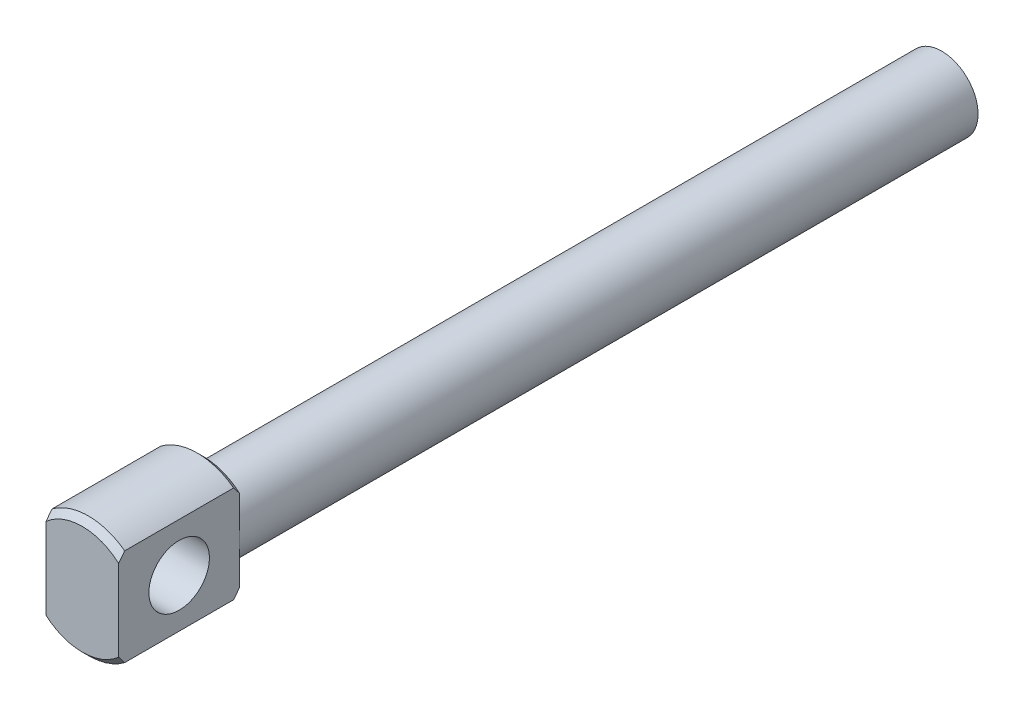
ISO-10303-21;
HEADER;
FILE_DESCRIPTION(('STEP AP214'),'2;1');
FILE_NAME('part.step','',(''),(''),'','','');
FILE_SCHEMA(('AUTOMOTIVE_DESIGN { 1 0 10303 214 1 1 1 1 }'));
ENDSEC;
DATA;
#1=APPLICATION_CONTEXT('core data for automotive mechanical design processes');
#2=APPLICATION_PROTOCOL_DEFINITION('international standard','automotive_design',2000,#1);
#3=PRODUCT_CONTEXT('',#1,'mechanical');
#4=PRODUCT('Part','Part','',(#3));
#5=PRODUCT_RELATED_PRODUCT_CATEGORY('part','',(#4));
#6=PRODUCT_DEFINITION_FORMATION('','',#4);
#7=PRODUCT_DEFINITION_CONTEXT('part definition',#1,'design');
#8=PRODUCT_DEFINITION('design','',#6,#7);
#9=PRODUCT_DEFINITION_SHAPE('','',#8);
#10=(LENGTH_UNIT() NAMED_UNIT(*) SI_UNIT(.MILLI.,.METRE.));
#11=(NAMED_UNIT(*) PLANE_ANGLE_UNIT() SI_UNIT($,.RADIAN.));
#12=(NAMED_UNIT(*) SI_UNIT($,.STERADIAN.) SOLID_ANGLE_UNIT());
#13=UNCERTAINTY_MEASURE_WITH_UNIT(LENGTH_MEASURE(1.E-05),#10,'distance_accuracy_value','');
#14=(GEOMETRIC_REPRESENTATION_CONTEXT(3) GLOBAL_UNCERTAINTY_ASSIGNED_CONTEXT((#13)) GLOBAL_UNIT_ASSIGNED_CONTEXT((#10,
#11,#12)) REPRESENTATION_CONTEXT('',''));
#15=CARTESIAN_POINT('',(0.,0.,0.));
#16=DIRECTION('',(0.,0.,1.));
#17=DIRECTION('',(1.,0.,0.));
#18=AXIS2_PLACEMENT_3D('',#15,#16,#17);
#19=CARTESIAN_POINT('',(0.,0.,-10.));
#20=DIRECTION('',(0.,0.,1.));
#21=DIRECTION('',(1.,0.,0.));
#22=AXIS2_PLACEMENT_3D('',#19,#20,#21);
#23=PLANE('',#22);
#24=DIRECTION('',(0.,-1.,0.));
#25=VECTOR('',#24,1.);
#26=CARTESIAN_POINT('',(-3.,4.,-10.));
#27=LINE('',#26,#25);
#28=CARTESIAN_POINT('',(-3.,3.35410196624966,-10.));
#29=VERTEX_POINT('',#28);
#30=CARTESIAN_POINT('',(-3.,0.,-10.));
#31=VERTEX_POINT('',#30);
#32=EDGE_CURVE('E116',#29,#31,#27,.T.);
#33=ORIENTED_EDGE('',*,*,#32,.F.);
#34=CARTESIAN_POINT('',(0.,0.,-10.));
#35=DIRECTION('',(0.,0.,1.));
#36=DIRECTION('',(1.,0.,0.));
#37=AXIS2_PLACEMENT_3D('',#34,#35,#36);
#38=CIRCLE('',#37,4.49999999999998);
#39=CARTESIAN_POINT('',(3.,3.35410196624966,-10.));
#40=VERTEX_POINT('',#39);
#41=EDGE_CURVE('E11',#29,#40,#38,.F.);
#42=ORIENTED_EDGE('',*,*,#41,.T.);
#43=DIRECTION('',(0.,1.,0.));
#44=VECTOR('',#43,1.);
#45=CARTESIAN_POINT('',(3.,4.,-10.));
#46=LINE('',#45,#44);
#47=CARTESIAN_POINT('',(3.,0.,-10.));
#48=VERTEX_POINT('',#47);
#49=EDGE_CURVE('E125',#48,#40,#46,.T.);
#50=ORIENTED_EDGE('',*,*,#49,.F.);
#51=CARTESIAN_POINT('',(0.,0.,-10.));
#52=DIRECTION('',(0.,0.,-1.));
#53=DIRECTION('',(-1.,0.,0.));
#54=AXIS2_PLACEMENT_3D('',#51,#52,#53);
#55=CIRCLE('',#54,3.);
#56=EDGE_CURVE('E135',#31,#48,#55,.T.);
#57=ORIENTED_EDGE('',*,*,#56,.F.);
#58=EDGE_LOOP('',(#33,#42,#50,#57));
#59=FACE_BOUND('',#58,.T.);
#60=ADVANCED_FACE('F45',(#59),#23,.F.);
#61=CARTESIAN_POINT('',(0.,0.,-10.));
#62=DIRECTION('',(0.,0.,1.));
#63=DIRECTION('',(1.,0.,0.));
#64=AXIS2_PLACEMENT_3D('',#61,#62,#63);
#65=CYLINDRICAL_SURFACE('',#64,5.);
#66=DIRECTION('',(0.,0.,1.));
#67=VECTOR('',#66,1.);
#68=CARTESIAN_POINT('',(-3.,4.,-10.));
#69=LINE('',#68,#67);
#70=CARTESIAN_POINT('',(-3.,4.,-9.49999999999998));
#71=VERTEX_POINT('',#70);
#72=CARTESIAN_POINT('',(-3.,4.,-0.500000000000006));
#73=VERTEX_POINT('',#72);
#74=EDGE_CURVE('E160',#71,#73,#69,.T.);
#75=ORIENTED_EDGE('',*,*,#74,.T.);
#76=CARTESIAN_POINT('',(0.,0.,-0.500000000000006));
#77=DIRECTION('',(0.,0.,1.));
#78=DIRECTION('',(1.,0.,0.));
#79=AXIS2_PLACEMENT_3D('',#76,#77,#78);
#80=CIRCLE('',#79,5.);
#81=CARTESIAN_POINT('',(3.,4.,-0.500000000000006));
#82=VERTEX_POINT('',#81);
#83=EDGE_CURVE('E292',#73,#82,#80,.F.);
#84=ORIENTED_EDGE('',*,*,#83,.T.);
#85=DIRECTION('',(0.,0.,1.));
#86=VECTOR('',#85,1.);
#87=CARTESIAN_POINT('',(3.,4.,-10.));
#88=LINE('',#87,#86);
#89=CARTESIAN_POINT('',(3.,4.,-9.49999999999998));
#90=VERTEX_POINT('',#89);
#91=EDGE_CURVE('E145',#90,#82,#88,.T.);
#92=ORIENTED_EDGE('',*,*,#91,.F.);
#93=CARTESIAN_POINT('',(0.,0.,-9.49999999999998));
#94=DIRECTION('',(0.,0.,1.));
#95=DIRECTION('',(1.,0.,0.));
#96=AXIS2_PLACEMENT_3D('',#93,#94,#95);
#97=CIRCLE('',#96,5.);
#98=EDGE_CURVE('E289',#90,#71,#97,.T.);
#99=ORIENTED_EDGE('',*,*,#98,.T.);
#100=EDGE_LOOP('',(#75,#84,#92,#99));
#101=FACE_BOUND('',#100,.T.);
#102=ADVANCED_FACE('F200',(#101),#65,.T.);
#103=CARTESIAN_POINT('',(3.,4.,-10.));
#104=DIRECTION('',(1.,0.,0.));
#105=DIRECTION('',(0.,0.,-1.));
#106=AXIS2_PLACEMENT_3D('',#103,#104,#105);
#107=PLANE('',#106);
#108=CARTESIAN_POINT('',(3.,0.,-4.99999999999999));
#109=DIRECTION('',(1.,0.,0.));
#110=DIRECTION('',(0.,0.,-1.));
#111=AXIS2_PLACEMENT_3D('',#108,#109,#110);
#112=CIRCLE('',#111,2.5);
#113=CARTESIAN_POINT('',(3.,0.,-2.49999999999999));
#114=VERTEX_POINT('',#113);
#115=EDGE_CURVE('E140',#114,#114,#112,.T.);
#116=ORIENTED_EDGE('',*,*,#115,.F.);
#117=EDGE_LOOP('',(#116));
#118=FACE_BOUND('',#117,.T.);
#119=DIRECTION('',(0.,1.,0.));
#120=VECTOR('',#119,1.);
#121=CARTESIAN_POINT('',(3.,4.,0.));
#122=LINE('',#121,#120);
#123=CARTESIAN_POINT('',(3.,-3.35410196624968,0.));
#124=VERTEX_POINT('',#123);
#125=CARTESIAN_POINT('',(3.,3.35410196624968,0.));
#126=VERTEX_POINT('',#125);
#127=EDGE_CURVE('E133',#124,#126,#122,.T.);
#128=ORIENTED_EDGE('',*,*,#127,.F.);
#129=CARTESIAN_POINT('',(3.,-3.35410196624968,0.));
#130=CARTESIAN_POINT('',(3.,-3.40868201484894,-0.0406833641701172));
#131=CARTESIAN_POINT('',(3.,-3.46305180825739,-0.0816477263784817));
#132=CARTESIAN_POINT('',(3.,-3.57140057631984,-0.16408211753417));
#133=CARTESIAN_POINT('',(3.,-3.62537957909934,-0.20555210950256));
#134=CARTESIAN_POINT('',(3.,-3.7329837797374,-0.28894689363928));
#135=CARTESIAN_POINT('',(3.,-3.78660898156137,-0.330871680696268));
#136=CARTESIAN_POINT('',(3.,-3.89353877710392,-0.41513619901305));
#137=CARTESIAN_POINT('',(3.,-3.94684334723989,-0.457475960206467));
#138=CARTESIAN_POINT('',(3.,-4.00000000000003,-0.499999999999966));
#139=B_SPLINE_CURVE_WITH_KNOTS('',3,(#129,#130,#131,#132,#133,#134,#135,#136,#137,#138),
.UNSPECIFIED.,.F.,.F.,(4,2,2,2,4),(0.,0.204221235056471,0.408427623047861,0.612631718380835,
0.816850653739193),.UNSPECIFIED.);
#140=CARTESIAN_POINT('',(3.,-4.,-0.500000000000006));
#141=VERTEX_POINT('',#140);
#142=EDGE_CURVE('E216',#124,#141,#139,.T.);
#143=ORIENTED_EDGE('',*,*,#142,.T.);
#144=DIRECTION('',(0.,0.,1.));
#145=VECTOR('',#144,1.);
#146=CARTESIAN_POINT('',(3.,-4.,-10.));
#147=LINE('',#146,#145);
#148=CARTESIAN_POINT('',(3.,-4.,-9.49999999999998));
#149=VERTEX_POINT('',#148);
#150=EDGE_CURVE('E152',#149,#141,#147,.T.);
#151=ORIENTED_EDGE('',*,*,#150,.F.);
#152=CARTESIAN_POINT('',(3.,-4.,-9.49999999999998));
#153=CARTESIAN_POINT('',(3.,-3.94684334723988,-9.5425240397935));
#154=CARTESIAN_POINT('',(3.,-3.89353877710391,-9.58486380098693));
#155=CARTESIAN_POINT('',(3.,-3.78660898156137,-9.66912831930373));
#156=CARTESIAN_POINT('',(3.,-3.73298377973739,-9.71105310636071));
#157=CARTESIAN_POINT('',(3.,-3.62537957909933,-9.79444789049743));
#158=CARTESIAN_POINT('',(3.,-3.57140057631982,-9.83591788246581));
#159=CARTESIAN_POINT('',(3.,-3.46305180825738,-9.91835227362152));
#160=CARTESIAN_POINT('',(3.,-3.40868201484895,-9.95931663582991));
#161=CARTESIAN_POINT('',(3.,-3.35410196624973,-10.0000000000001));
#162=B_SPLINE_CURVE_WITH_KNOTS('',3,(#152,#153,#154,#155,#156,#157,#158,#159,#160,#161),
.UNSPECIFIED.,.F.,.F.,(4,2,2,2,4),(0.,0.204218935358365,0.408423030691344,0.612629418682739,
0.816850653739216),.UNSPECIFIED.);
#163=CARTESIAN_POINT('',(3.,-3.35410196624966,-10.));
#164=VERTEX_POINT('',#163);
#165=EDGE_CURVE('E188',#149,#164,#162,.T.);
#166=ORIENTED_EDGE('',*,*,#165,.T.);
#167=EDGE_CURVE('E157',#164,#48,#46,.T.);
#168=ORIENTED_EDGE('',*,*,#167,.T.);
#169=ORIENTED_EDGE('',*,*,#49,.T.);
#170=CARTESIAN_POINT('',(3.,3.35410196624966,-10.));
#171=CARTESIAN_POINT('',(3.,3.40868201484892,-9.95931663582988));
#172=CARTESIAN_POINT('',(3.,3.46305180825737,-9.91835227362152));
#173=CARTESIAN_POINT('',(3.,3.57140057631982,-9.83591788246583));
#174=CARTESIAN_POINT('',(3.,3.62537957909933,-9.79444789049743));
#175=CARTESIAN_POINT('',(3.,3.73298377973739,-9.71105310636071));
#176=CARTESIAN_POINT('',(3.,3.78660898156136,-9.66912831930372));
#177=CARTESIAN_POINT('',(3.,3.89353877710392,-9.58486380098694));
#178=CARTESIAN_POINT('',(3.,3.94684334723989,-9.54252403979352));
#179=CARTESIAN_POINT('',(3.,4.00000000000003,-9.50000000000002));
#180=B_SPLINE_CURVE_WITH_KNOTS('',3,(#170,#171,#172,#173,#174,#175,#176,#177,#178,#179),
.UNSPECIFIED.,.F.,.F.,(4,2,2,2,4),(0.,0.204221235056477,0.408427623047874,0.612631718380854,
0.816850653739217),.UNSPECIFIED.);
#181=EDGE_CURVE('E180',#40,#90,#180,.T.);
#182=ORIENTED_EDGE('',*,*,#181,.T.);
#183=ORIENTED_EDGE('',*,*,#91,.T.);
#184=CARTESIAN_POINT('',(3.,4.,-0.500000000000006));
#185=CARTESIAN_POINT('',(3.,3.94684334723988,-0.457475960206485));
#186=CARTESIAN_POINT('',(3.,3.89353877710392,-0.415136199013056));
#187=CARTESIAN_POINT('',(3.,3.78660898156137,-0.330871680696263));
#188=CARTESIAN_POINT('',(3.,3.7329837797374,-0.288946893639278));
#189=CARTESIAN_POINT('',(3.,3.62537957909934,-0.205552109502564));
#190=CARTESIAN_POINT('',(3.,3.57140057631983,-0.16408211753418));
#191=CARTESIAN_POINT('',(3.,3.46305180825739,-0.0816477263784743));
#192=CARTESIAN_POINT('',(3.,3.40868201484897,-0.0406833641700872));
#193=CARTESIAN_POINT('',(3.,3.35410196624975,0.));
#194=B_SPLINE_CURVE_WITH_KNOTS('',3,(#184,#185,#186,#187,#188,#189,#190,#191,#192,#193),
.UNSPECIFIED.,.F.,.F.,(4,2,2,2,4),(0.,0.204218935358358,0.408423030691332,0.612629418682721,
0.816850653739191),.UNSPECIFIED.);
#195=EDGE_CURVE('E209',#82,#126,#194,.T.);
#196=ORIENTED_EDGE('',*,*,#195,.T.);
#197=EDGE_LOOP('',(#128,#143,#151,#166,#168,#169,#182,#183,#196));
#198=FACE_BOUND('',#197,.T.);
#199=ADVANCED_FACE('F194',(#118,#198),#107,.T.);
#200=CARTESIAN_POINT('',(0.,0.,-10.));
#201=DIRECTION('',(0.,0.,1.));
#202=DIRECTION('',(1.,0.,0.));
#203=AXIS2_PLACEMENT_3D('',#200,#201,#202);
#204=CYLINDRICAL_SURFACE('',#203,5.);
#205=ORIENTED_EDGE('',*,*,#150,.T.);
#206=CARTESIAN_POINT('',(0.,0.,-0.500000000000006));
#207=DIRECTION('',(0.,0.,1.));
#208=DIRECTION('',(1.,0.,0.));
#209=AXIS2_PLACEMENT_3D('',#206,#207,#208);
#210=CIRCLE('',#209,5.);
#211=CARTESIAN_POINT('',(-3.,-4.,-0.500000000000006));
#212=VERTEX_POINT('',#211);
#213=EDGE_CURVE('E271',#141,#212,#210,.F.);
#214=ORIENTED_EDGE('',*,*,#213,.T.);
#215=DIRECTION('',(0.,0.,1.));
#216=VECTOR('',#215,1.);
#217=CARTESIAN_POINT('',(-3.,-4.,-10.));
#218=LINE('',#217,#216);
#219=CARTESIAN_POINT('',(-3.,-4.,-9.49999999999998));
#220=VERTEX_POINT('',#219);
#221=EDGE_CURVE('E171',#220,#212,#218,.T.);
#222=ORIENTED_EDGE('',*,*,#221,.F.);
#223=CARTESIAN_POINT('',(0.,0.,-9.49999999999998));
#224=DIRECTION('',(0.,0.,1.));
#225=DIRECTION('',(1.,0.,0.));
#226=AXIS2_PLACEMENT_3D('',#223,#224,#225);
#227=CIRCLE('',#226,5.);
#228=EDGE_CURVE('E273',#220,#149,#227,.T.);
#229=ORIENTED_EDGE('',*,*,#228,.T.);
#230=EDGE_LOOP('',(#205,#214,#222,#229));
#231=FACE_BOUND('',#230,.T.);
#232=ADVANCED_FACE('F199',(#231),#204,.T.);
#233=CARTESIAN_POINT('',(-3.,4.,-10.));
#234=DIRECTION('',(-1.,0.,0.));
#235=DIRECTION('',(0.,0.,1.));
#236=AXIS2_PLACEMENT_3D('',#233,#234,#235);
#237=PLANE('',#236);
#238=CARTESIAN_POINT('',(-3.,0.,-4.99999999999999));
#239=DIRECTION('',(-1.,0.,0.));
#240=DIRECTION('',(0.,0.,1.));
#241=AXIS2_PLACEMENT_3D('',#238,#239,#240);
#242=CIRCLE('',#241,2.5);
#243=CARTESIAN_POINT('',(-3.,0.,-2.49999999999999));
#244=VERTEX_POINT('',#243);
#245=EDGE_CURVE('E332',#244,#244,#242,.T.);
#246=ORIENTED_EDGE('',*,*,#245,.F.);
#247=EDGE_LOOP('',(#246));
#248=FACE_BOUND('',#247,.T.);
#249=ORIENTED_EDGE('',*,*,#221,.T.);
#250=CARTESIAN_POINT('',(-3.,-4.,-0.500000000000006));
#251=CARTESIAN_POINT('',(-3.,-3.94684334723988,-0.457475960206485));
#252=CARTESIAN_POINT('',(-3.,-3.89353877710392,-0.415136199013056));
#253=CARTESIAN_POINT('',(-3.,-3.78660898156137,-0.330871680696263));
#254=CARTESIAN_POINT('',(-3.,-3.7329837797374,-0.288946893639277));
#255=CARTESIAN_POINT('',(-3.,-3.62537957909934,-0.205552109502564));
#256=CARTESIAN_POINT('',(-3.,-3.57140057631983,-0.16408211753418));
#257=CARTESIAN_POINT('',(-3.,-3.46305180825739,-0.081647726378474));
#258=CARTESIAN_POINT('',(-3.,-3.40868201484897,-0.040683364170087));
#259=CARTESIAN_POINT('',(-3.,-3.35410196624975,0.));
#260=B_SPLINE_CURVE_WITH_KNOTS('',3,(#250,#251,#252,#253,#254,#255,#256,#257,#258,#259),
.UNSPECIFIED.,.F.,.F.,(4,2,2,2,4),(0.,0.204218935358358,0.408423030691332,0.612629418682722,
0.816850653739192),.UNSPECIFIED.);
#261=CARTESIAN_POINT('',(-3.,-3.35410196624968,0.));
#262=VERTEX_POINT('',#261);
#263=EDGE_CURVE('E247',#212,#262,#260,.T.);
#264=ORIENTED_EDGE('',*,*,#263,.T.);
#265=DIRECTION('',(0.,-1.,0.));
#266=VECTOR('',#265,1.);
#267=CARTESIAN_POINT('',(-3.,4.,0.));
#268=LINE('',#267,#266);
#269=CARTESIAN_POINT('',(-3.,3.35410196624968,0.));
#270=VERTEX_POINT('',#269);
#271=EDGE_CURVE('E161',#270,#262,#268,.T.);
#272=ORIENTED_EDGE('',*,*,#271,.F.);
#273=CARTESIAN_POINT('',(-3.,3.35410196624968,0.));
#274=CARTESIAN_POINT('',(-3.,3.40868201484894,-0.0406833641701172));
#275=CARTESIAN_POINT('',(-3.,3.46305180825739,-0.0816477263784817));
#276=CARTESIAN_POINT('',(-3.,3.57140057631984,-0.16408211753417));
#277=CARTESIAN_POINT('',(-3.,3.62537957909934,-0.20555210950256));
#278=CARTESIAN_POINT('',(-3.,3.7329837797374,-0.28894689363928));
#279=CARTESIAN_POINT('',(-3.,3.78660898156137,-0.330871680696268));
#280=CARTESIAN_POINT('',(-3.,3.89353877710392,-0.41513619901305));
#281=CARTESIAN_POINT('',(-3.,3.94684334723989,-0.457475960206467));
#282=CARTESIAN_POINT('',(-3.,4.00000000000003,-0.499999999999966));
#283=B_SPLINE_CURVE_WITH_KNOTS('',3,(#273,#274,#275,#276,#277,#278,#279,#280,#281,#282),
.UNSPECIFIED.,.F.,.F.,(4,2,2,2,4),(0.,0.204221235056471,0.408427623047861,0.612631718380835,
0.816850653739193),.UNSPECIFIED.);
#284=EDGE_CURVE('E239',#270,#73,#283,.T.);
#285=ORIENTED_EDGE('',*,*,#284,.T.);
#286=ORIENTED_EDGE('',*,*,#74,.F.);
#287=CARTESIAN_POINT('',(-3.,4.,-9.49999999999998));
#288=CARTESIAN_POINT('',(-3.,3.94684334723988,-9.5425240397935));
#289=CARTESIAN_POINT('',(-3.,3.89353877710391,-9.58486380098693));
#290=CARTESIAN_POINT('',(-3.,3.78660898156137,-9.66912831930373));
#291=CARTESIAN_POINT('',(-3.,3.73298377973739,-9.71105310636071));
#292=CARTESIAN_POINT('',(-3.,3.62537957909933,-9.79444789049743));
#293=CARTESIAN_POINT('',(-3.,3.57140057631982,-9.83591788246581));
#294=CARTESIAN_POINT('',(-3.,3.46305180825738,-9.91835227362152));
#295=CARTESIAN_POINT('',(-3.,3.40868201484895,-9.95931663582991));
#296=CARTESIAN_POINT('',(-3.,3.35410196624973,-10.0000000000001));
#297=B_SPLINE_CURVE_WITH_KNOTS('',3,(#287,#288,#289,#290,#291,#292,#293,#294,#295,#296),
.UNSPECIFIED.,.F.,.F.,(4,2,2,2,4),(0.,0.204218935358365,0.408423030691344,0.612629418682739,
0.816850653739216),.UNSPECIFIED.);
#298=EDGE_CURVE('E70',#71,#29,#297,.T.);
#299=ORIENTED_EDGE('',*,*,#298,.T.);
#300=ORIENTED_EDGE('',*,*,#32,.T.);
#301=CARTESIAN_POINT('',(-3.,-3.35410196624966,-10.));
#302=VERTEX_POINT('',#301);
#303=EDGE_CURVE('E119',#31,#302,#27,.T.);
#304=ORIENTED_EDGE('',*,*,#303,.T.);
#305=CARTESIAN_POINT('',(-3.,-3.35410196624966,-10.));
#306=CARTESIAN_POINT('',(-3.,-3.40868201484892,-9.95931663582988));
#307=CARTESIAN_POINT('',(-3.,-3.46305180825737,-9.91835227362152));
#308=CARTESIAN_POINT('',(-3.,-3.57140057631982,-9.83591788246583));
#309=CARTESIAN_POINT('',(-3.,-3.62537957909933,-9.79444789049743));
#310=CARTESIAN_POINT('',(-3.,-3.73298377973739,-9.71105310636071));
#311=CARTESIAN_POINT('',(-3.,-3.78660898156136,-9.66912831930372));
#312=CARTESIAN_POINT('',(-3.,-3.89353877710392,-9.58486380098694));
#313=CARTESIAN_POINT('',(-3.,-3.94684334723989,-9.54252403979352));
#314=CARTESIAN_POINT('',(-3.,-4.00000000000003,-9.50000000000002));
#315=B_SPLINE_CURVE_WITH_KNOTS('',3,(#305,#306,#307,#308,#309,#310,#311,#312,#313,#314),
.UNSPECIFIED.,.F.,.F.,(4,2,2,2,4),(0.,0.204221235056477,0.408427623047874,0.612631718380854,
0.816850653739217),.UNSPECIFIED.);
#316=EDGE_CURVE('E248',#302,#220,#315,.T.);
#317=ORIENTED_EDGE('',*,*,#316,.T.);
#318=EDGE_LOOP('',(#249,#264,#272,#285,#286,#299,#300,#304,#317));
#319=FACE_BOUND('',#318,.T.);
#320=ADVANCED_FACE('F118',(#248,#319),#237,.T.);
#321=ORIENTED_EDGE('',*,*,#167,.F.);
#322=CARTESIAN_POINT('',(0.,0.,-10.));
#323=DIRECTION('',(0.,0.,1.));
#324=DIRECTION('',(1.,0.,0.));
#325=AXIS2_PLACEMENT_3D('',#322,#323,#324);
#326=CIRCLE('',#325,4.49999999999998);
#327=EDGE_CURVE('E56',#164,#302,#326,.F.);
#328=ORIENTED_EDGE('',*,*,#327,.T.);
#329=ORIENTED_EDGE('',*,*,#303,.F.);
#330=EDGE_CURVE('E130',#48,#31,#55,.T.);
#331=ORIENTED_EDGE('',*,*,#330,.F.);
#332=EDGE_LOOP('',(#321,#328,#329,#331));
#333=FACE_BOUND('',#332,.T.);
#334=ADVANCED_FACE('F128',(#333),#23,.F.);
#335=CARTESIAN_POINT('',(0.,0.,0.));
#336=DIRECTION('',(0.,0.,1.));
#337=DIRECTION('',(1.,0.,0.));
#338=AXIS2_PLACEMENT_3D('',#335,#336,#337);
#339=PLANE('',#338);
#340=ORIENTED_EDGE('',*,*,#271,.T.);
#341=CARTESIAN_POINT('',(0.,0.,0.));
#342=DIRECTION('',(0.,0.,1.));
#343=DIRECTION('',(1.,0.,0.));
#344=AXIS2_PLACEMENT_3D('',#341,#342,#343);
#345=CIRCLE('',#344,4.5);
#346=EDGE_CURVE('E149',#262,#124,#345,.T.);
#347=ORIENTED_EDGE('',*,*,#346,.T.);
#348=ORIENTED_EDGE('',*,*,#127,.T.);
#349=CARTESIAN_POINT('',(0.,0.,0.));
#350=DIRECTION('',(0.,0.,1.));
#351=DIRECTION('',(1.,0.,0.));
#352=AXIS2_PLACEMENT_3D('',#349,#350,#351);
#353=CIRCLE('',#352,4.5);
#354=EDGE_CURVE('E144',#126,#270,#353,.T.);
#355=ORIENTED_EDGE('',*,*,#354,.T.);
#356=EDGE_LOOP('',(#340,#347,#348,#355));
#357=FACE_BOUND('',#356,.T.);
#358=ADVANCED_FACE('F202',(#357),#339,.T.);
#359=CARTESIAN_POINT('',(0.,0.,-71.));
#360=DIRECTION('',(0.,0.,1.));
#361=DIRECTION('',(1.,0.,0.));
#362=AXIS2_PLACEMENT_3D('',#359,#360,#361);
#363=CYLINDRICAL_SURFACE('',#362,3.);
#364=CARTESIAN_POINT('',(0.,0.,-71.));
#365=DIRECTION('',(0.,0.,-1.));
#366=DIRECTION('',(-1.,0.,0.));
#367=AXIS2_PLACEMENT_3D('',#364,#365,#366);
#368=CIRCLE('',#367,3.);
#369=CARTESIAN_POINT('',(-3.,0.,-71.));
#370=VERTEX_POINT('',#369);
#371=EDGE_CURVE('E139',#370,#370,#368,.T.);
#372=ORIENTED_EDGE('',*,*,#371,.F.);
#373=EDGE_LOOP('',(#372));
#374=FACE_BOUND('',#373,.T.);
#375=ORIENTED_EDGE('',*,*,#56,.T.);
#376=ORIENTED_EDGE('',*,*,#330,.T.);
#377=EDGE_LOOP('',(#375,#376));
#378=FACE_BOUND('',#377,.T.);
#379=ADVANCED_FACE('F142',(#374,#378),#363,.T.);
#380=CARTESIAN_POINT('',(0.,0.,-71.));
#381=DIRECTION('',(0.,0.,-1.));
#382=DIRECTION('',(-1.,0.,0.));
#383=AXIS2_PLACEMENT_3D('',#380,#381,#382);
#384=PLANE('',#383);
#385=ORIENTED_EDGE('',*,*,#371,.T.);
#386=EDGE_LOOP('',(#385));
#387=FACE_BOUND('',#386,.T.);
#388=ADVANCED_FACE('F309',(#387),#384,.T.);
#389=CARTESIAN_POINT('',(0.,0.,0.));
#390=DIRECTION('',(0.,0.,-1.));
#391=DIRECTION('',(-1.,0.,0.));
#392=AXIS2_PLACEMENT_3D('',#389,#390,#391);
#393=CONICAL_SURFACE('',#392,4.5,0.785398163397446);
#394=ORIENTED_EDGE('',*,*,#263,.F.);
#395=ORIENTED_EDGE('',*,*,#213,.F.);
#396=ORIENTED_EDGE('',*,*,#142,.F.);
#397=ORIENTED_EDGE('',*,*,#346,.F.);
#398=EDGE_LOOP('',(#394,#395,#396,#397));
#399=FACE_BOUND('',#398,.T.);
#400=ADVANCED_FACE('F232',(#399),#393,.T.);
#401=CARTESIAN_POINT('',(0.,0.,0.));
#402=DIRECTION('',(0.,0.,-1.));
#403=DIRECTION('',(-1.,0.,0.));
#404=AXIS2_PLACEMENT_3D('',#401,#402,#403);
#405=CONICAL_SURFACE('',#404,4.5,0.785398163397446);
#406=ORIENTED_EDGE('',*,*,#195,.F.);
#407=ORIENTED_EDGE('',*,*,#83,.F.);
#408=ORIENTED_EDGE('',*,*,#284,.F.);
#409=ORIENTED_EDGE('',*,*,#354,.F.);
#410=EDGE_LOOP('',(#406,#407,#408,#409));
#411=FACE_BOUND('',#410,.T.);
#412=ADVANCED_FACE('F224',(#411),#405,.T.);
#413=CARTESIAN_POINT('',(0.,0.,-9.49999999999998));
#414=DIRECTION('',(0.,0.,1.));
#415=DIRECTION('',(1.,0.,0.));
#416=AXIS2_PLACEMENT_3D('',#413,#414,#415);
#417=CONICAL_SURFACE('',#416,5.,0.785398163397444);
#418=ORIENTED_EDGE('',*,*,#316,.F.);
#419=ORIENTED_EDGE('',*,*,#327,.F.);
#420=ORIENTED_EDGE('',*,*,#165,.F.);
#421=ORIENTED_EDGE('',*,*,#228,.F.);
#422=EDGE_LOOP('',(#418,#419,#420,#421));
#423=FACE_BOUND('',#422,.T.);
#424=ADVANCED_FACE('F231',(#423),#417,.T.);
#425=CARTESIAN_POINT('',(0.,0.,-9.49999999999998));
#426=DIRECTION('',(0.,0.,1.));
#427=DIRECTION('',(1.,0.,0.));
#428=AXIS2_PLACEMENT_3D('',#425,#426,#427);
#429=CONICAL_SURFACE('',#428,5.,0.785398163397444);
#430=ORIENTED_EDGE('',*,*,#181,.F.);
#431=ORIENTED_EDGE('',*,*,#41,.F.);
#432=ORIENTED_EDGE('',*,*,#298,.F.);
#433=ORIENTED_EDGE('',*,*,#98,.F.);
#434=EDGE_LOOP('',(#430,#431,#432,#433));
#435=FACE_BOUND('',#434,.T.);
#436=ADVANCED_FACE('F48',(#435),#429,.T.);
#437=CARTESIAN_POINT('',(58.,0.,-4.99999999999999));
#438=DIRECTION('',(-1.,0.,0.));
#439=DIRECTION('',(0.,0.,1.));
#440=AXIS2_PLACEMENT_3D('',#437,#438,#439);
#441=CYLINDRICAL_SURFACE('',#440,2.5);
#442=CARTESIAN_POINT('',(3.,0.,-2.49999999999999));
#443=CARTESIAN_POINT('',(2.9375,0.,-2.49999999999999));
#444=CARTESIAN_POINT('',(2.875,0.,-2.49999999999999));
#445=CARTESIAN_POINT('',(2.75,0.,-2.49999999999999));
#446=CARTESIAN_POINT('',(2.6875,0.,-2.49999999999999));
#447=CARTESIAN_POINT('',(2.5625,0.,-2.49999999999999));
#448=CARTESIAN_POINT('',(2.5,0.,-2.49999999999999));
#449=CARTESIAN_POINT('',(2.375,0.,-2.49999999999999));
#450=CARTESIAN_POINT('',(2.3125,0.,-2.49999999999999));
#451=CARTESIAN_POINT('',(2.1875,0.,-2.49999999999999));
#452=CARTESIAN_POINT('',(2.125,0.,-2.49999999999999));
#453=CARTESIAN_POINT('',(1.99999999999999,0.,-2.49999999999999));
#454=CARTESIAN_POINT('',(1.93749999999999,0.,-2.49999999999999));
#455=CARTESIAN_POINT('',(1.81249999999999,0.,-2.49999999999999));
#456=CARTESIAN_POINT('',(1.74999999999999,0.,-2.49999999999999));
#457=CARTESIAN_POINT('',(1.62499999999999,0.,-2.49999999999999));
#458=CARTESIAN_POINT('',(1.56249999999999,0.,-2.49999999999999));
#459=CARTESIAN_POINT('',(1.4375,0.,-2.49999999999999));
#460=CARTESIAN_POINT('',(1.375,0.,-2.49999999999999));
#461=CARTESIAN_POINT('',(1.25,0.,-2.49999999999999));
#462=CARTESIAN_POINT('',(1.1875,0.,-2.49999999999999));
#463=CARTESIAN_POINT('',(1.0625,0.,-2.49999999999999));
#464=CARTESIAN_POINT('',(1.,0.,-2.49999999999999));
#465=CARTESIAN_POINT('',(0.875000000000001,0.,-2.49999999999999));
#466=CARTESIAN_POINT('',(0.812500000000001,0.,-2.49999999999999));
#467=CARTESIAN_POINT('',(0.687500000000001,0.,-2.49999999999999));
#468=CARTESIAN_POINT('',(0.625000000000001,0.,-2.49999999999999));
#469=CARTESIAN_POINT('',(0.5,0.,-2.49999999999999));
#470=CARTESIAN_POINT('',(0.4375,0.,-2.49999999999999));
#471=CARTESIAN_POINT('',(0.3125,0.,-2.49999999999999));
#472=CARTESIAN_POINT('',(0.25,0.,-2.49999999999999));
#473=CARTESIAN_POINT('',(0.125,0.,-2.49999999999999));
#474=CARTESIAN_POINT('',(0.0625,0.,-2.49999999999999));
#475=CARTESIAN_POINT('',(-0.0625,0.,-2.49999999999999));
#476=CARTESIAN_POINT('',(-0.125,0.,-2.49999999999999));
#477=CARTESIAN_POINT('',(-0.25,0.,-2.49999999999999));
#478=CARTESIAN_POINT('',(-0.3125,0.,-2.49999999999999));
#479=CARTESIAN_POINT('',(-0.4375,0.,-2.49999999999999));
#480=CARTESIAN_POINT('',(-0.5,0.,-2.49999999999999));
#481=CARTESIAN_POINT('',(-0.625000000000001,0.,-2.49999999999999));
#482=CARTESIAN_POINT('',(-0.687500000000001,0.,-2.49999999999999));
#483=CARTESIAN_POINT('',(-0.812500000000001,0.,-2.49999999999999));
#484=CARTESIAN_POINT('',(-0.875000000000001,0.,-2.49999999999999));
#485=CARTESIAN_POINT('',(-1.,0.,-2.49999999999999));
#486=CARTESIAN_POINT('',(-1.0625,0.,-2.49999999999999));
#487=CARTESIAN_POINT('',(-1.1875,0.,-2.49999999999999));
#488=CARTESIAN_POINT('',(-1.25,0.,-2.49999999999999));
#489=CARTESIAN_POINT('',(-1.375,0.,-2.49999999999999));
#490=CARTESIAN_POINT('',(-1.4375,0.,-2.49999999999999));
#491=CARTESIAN_POINT('',(-1.5625,0.,-2.49999999999999));
#492=CARTESIAN_POINT('',(-1.625,0.,-2.49999999999999));
#493=CARTESIAN_POINT('',(-1.75,0.,-2.49999999999999));
#494=CARTESIAN_POINT('',(-1.8125,0.,-2.49999999999999));
#495=CARTESIAN_POINT('',(-1.93749999999999,0.,-2.49999999999999));
#496=CARTESIAN_POINT('',(-1.99999999999999,0.,-2.49999999999999));
#497=CARTESIAN_POINT('',(-2.125,0.,-2.49999999999999));
#498=CARTESIAN_POINT('',(-2.1875,0.,-2.49999999999999));
#499=CARTESIAN_POINT('',(-2.3125,0.,-2.49999999999999));
#500=CARTESIAN_POINT('',(-2.375,0.,-2.49999999999999));
#501=CARTESIAN_POINT('',(-2.5,0.,-2.49999999999999));
#502=CARTESIAN_POINT('',(-2.5625,0.,-2.49999999999999));
#503=CARTESIAN_POINT('',(-2.6875,0.,-2.49999999999999));
#504=CARTESIAN_POINT('',(-2.75,0.,-2.49999999999999));
#505=CARTESIAN_POINT('',(-2.875,0.,-2.49999999999999));
#506=CARTESIAN_POINT('',(-2.9375,0.,-2.49999999999999));
#507=CARTESIAN_POINT('',(-3.,0.,-2.49999999999999));
#508=B_SPLINE_CURVE_WITH_KNOTS('',3,(#442,#443,#444,#445,#446,#447,#448,#449,#450,#451,#452,
#453,#454,#455,#456,#457,#458,#459,#460,#461,#462,#463,#464,#465,#466,#467,#468,#469,#470,#471,
#472,#473,#474,#475,#476,#477,#478,#479,#480,#481,#482,#483,#484,#485,#486,#487,#488,#489,#490,
#491,#492,#493,#494,#495,#496,#497,#498,#499,#500,#501,#502,#503,#504,#505,#506,#507),
.UNSPECIFIED.,.F.,.F.,(4,2,2,2,2,2,2,2,2,2,2,2,2,2,2,2,2,2,2,2,2,2,2,2,2,2,2,2,2,2,2,2,4),(0.,
0.1875,0.375,0.5625,0.750000000000001,0.937500000000001,1.125,1.3125,1.5,1.68749999999999,
1.87499999999999,2.06249999999999,2.25,2.4375,2.625,2.8125,3.,3.1875,3.375,3.5625,3.75,3.9375,
4.125,4.3125,4.49999999999999,4.6875,4.87499999999999,5.06249999999999,5.24999999999999,
5.43749999999999,5.62499999999999,5.81249999999999,5.99999999999999),.UNSPECIFIED.);
#509=EDGE_CURVE('BSEAM320',#114,#244,#508,.T.);
#510=ORIENTED_EDGE('',*,*,#115,.T.);
#511=ORIENTED_EDGE('',*,*,#245,.T.);
#512=ORIENTED_EDGE('',*,*,#509,.T.);
#513=ORIENTED_EDGE('',*,*,#509,.F.);
#514=EDGE_LOOP('',(#510,#512,#511,#513));
#515=FACE_BOUND('',#514,.T.);
#516=ADVANCED_FACE('F320',(#515),#441,.F.);
#517=CLOSED_SHELL('',(#60,#102,#199,#232,#320,#334,#358,#379,#388,#400,#412,#424,#436,#516));
#518=MANIFOLD_SOLID_BREP('B2',#517);
#519=ADVANCED_BREP_SHAPE_REPRESENTATION('',(#18,#518),#14);
#520=SHAPE_DEFINITION_REPRESENTATION(#9,#519);
ENDSEC;
END-ISO-10303-21;
